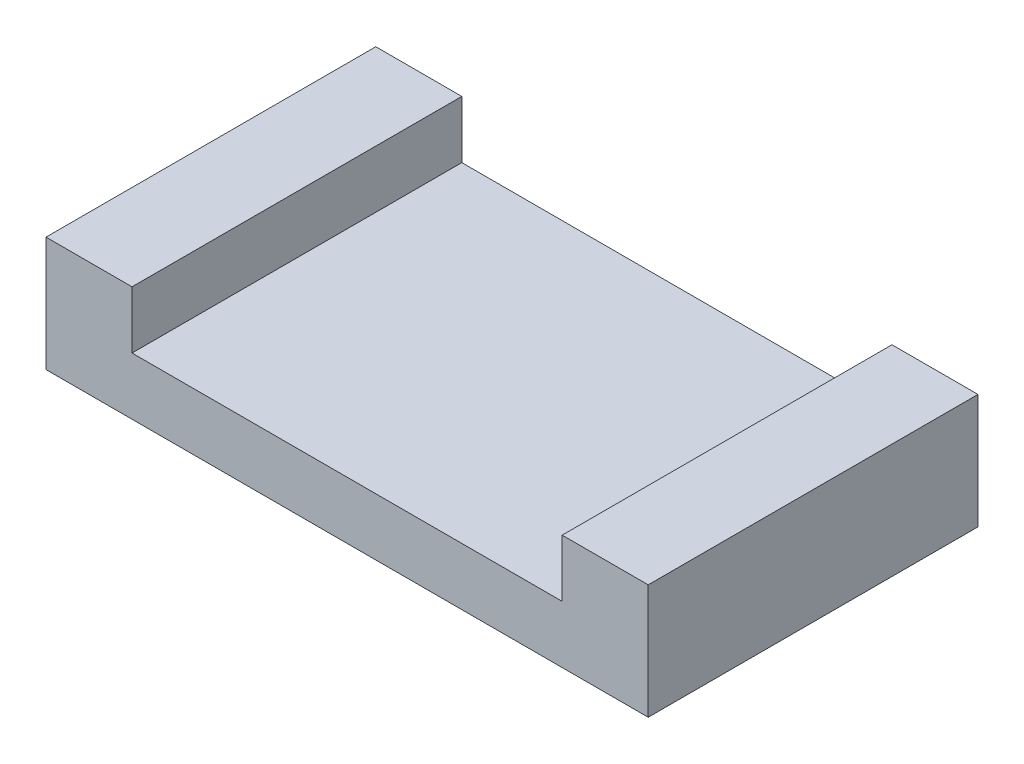
ISO-10303-21;
HEADER;
FILE_DESCRIPTION(('STEP AP214'),'2;1');
FILE_NAME('part.step','',(''),(''),'','','');
FILE_SCHEMA(('AUTOMOTIVE_DESIGN { 1 0 10303 214 1 1 1 1 }'));
ENDSEC;
DATA;
#1=APPLICATION_CONTEXT('core data for automotive mechanical design processes');
#2=APPLICATION_PROTOCOL_DEFINITION('international standard','automotive_design',2000,#1);
#3=PRODUCT_CONTEXT('',#1,'mechanical');
#4=PRODUCT('Part','Part','',(#3));
#5=PRODUCT_RELATED_PRODUCT_CATEGORY('part','',(#4));
#6=PRODUCT_DEFINITION_FORMATION('','',#4);
#7=PRODUCT_DEFINITION_CONTEXT('part definition',#1,'design');
#8=PRODUCT_DEFINITION('design','',#6,#7);
#9=PRODUCT_DEFINITION_SHAPE('','',#8);
#10=(LENGTH_UNIT() NAMED_UNIT(*) SI_UNIT(.MILLI.,.METRE.));
#11=(NAMED_UNIT(*) PLANE_ANGLE_UNIT() SI_UNIT($,.RADIAN.));
#12=(NAMED_UNIT(*) SI_UNIT($,.STERADIAN.) SOLID_ANGLE_UNIT());
#13=UNCERTAINTY_MEASURE_WITH_UNIT(LENGTH_MEASURE(1.E-05),#10,'distance_accuracy_value','');
#14=(GEOMETRIC_REPRESENTATION_CONTEXT(3) GLOBAL_UNCERTAINTY_ASSIGNED_CONTEXT((#13)) GLOBAL_UNIT_ASSIGNED_CONTEXT((#10,
#11,#12)) REPRESENTATION_CONTEXT('',''));
#15=CARTESIAN_POINT('',(0.,0.,0.));
#16=DIRECTION('',(0.,0.,1.));
#17=DIRECTION('',(1.,0.,0.));
#18=AXIS2_PLACEMENT_3D('',#15,#16,#17);
#19=CARTESIAN_POINT('',(0.,20.,0.));
#20=DIRECTION('',(0.,1.,0.));
#21=DIRECTION('',(0.,0.,1.));
#22=AXIS2_PLACEMENT_3D('',#19,#20,#21);
#23=PLANE('',#22);
#24=DIRECTION('',(1.,0.,0.));
#25=VECTOR('',#24,1.);
#26=CARTESIAN_POINT('',(105.,20.,57.5));
#27=LINE('',#26,#25);
#28=CARTESIAN_POINT('',(-75.,20.,57.5));
#29=VERTEX_POINT('',#28);
#30=CARTESIAN_POINT('',(75.,20.,57.5));
#31=VERTEX_POINT('',#30);
#32=EDGE_CURVE('E53',#29,#31,#27,.T.);
#33=ORIENTED_EDGE('',*,*,#32,.T.);
#34=DIRECTION('',(0.,0.,1.));
#35=VECTOR('',#34,1.);
#36=CARTESIAN_POINT('',(75.,20.,-57.5));
#37=LINE('',#36,#35);
#38=CARTESIAN_POINT('',(75.,20.,-57.5));
#39=VERTEX_POINT('',#38);
#40=EDGE_CURVE('E48',#39,#31,#37,.T.);
#41=ORIENTED_EDGE('',*,*,#40,.F.);
#42=DIRECTION('',(-1.,0.,0.));
#43=VECTOR('',#42,1.);
#44=CARTESIAN_POINT('',(105.,20.,-57.5));
#45=LINE('',#44,#43);
#46=CARTESIAN_POINT('',(-75.,20.,-57.5));
#47=VERTEX_POINT('',#46);
#48=EDGE_CURVE('E151',#39,#47,#45,.T.);
#49=ORIENTED_EDGE('',*,*,#48,.T.);
#50=DIRECTION('',(0.,0.,-1.));
#51=VECTOR('',#50,1.);
#52=CARTESIAN_POINT('',(-75.,20.,-57.5));
#53=LINE('',#52,#51);
#54=EDGE_CURVE('E130',#29,#47,#53,.T.);
#55=ORIENTED_EDGE('',*,*,#54,.F.);
#56=EDGE_LOOP('',(#33,#41,#49,#55));
#57=FACE_BOUND('',#56,.T.);
#58=ADVANCED_FACE('F33',(#57),#23,.T.);
#59=CARTESIAN_POINT('',(-105.,20.,57.5));
#60=DIRECTION('',(1.,0.,0.));
#61=DIRECTION('',(0.,0.,-1.));
#62=AXIS2_PLACEMENT_3D('',#59,#60,#61);
#63=PLANE('',#62);
#64=DIRECTION('',(0.,0.,1.));
#65=VECTOR('',#64,1.);
#66=CARTESIAN_POINT('',(-105.,0.,57.5));
#67=LINE('',#66,#65);
#68=CARTESIAN_POINT('',(-105.,0.,-57.5));
#69=VERTEX_POINT('',#68);
#70=CARTESIAN_POINT('',(-105.,0.,57.5));
#71=VERTEX_POINT('',#70);
#72=EDGE_CURVE('E149',#69,#71,#67,.T.);
#73=ORIENTED_EDGE('',*,*,#72,.T.);
#74=DIRECTION('',(0.,-1.,0.));
#75=VECTOR('',#74,1.);
#76=CARTESIAN_POINT('',(-105.,20.,57.5));
#77=LINE('',#76,#75);
#78=CARTESIAN_POINT('',(-105.,40.,57.5));
#79=VERTEX_POINT('',#78);
#80=EDGE_CURVE('E11',#79,#71,#77,.T.);
#81=ORIENTED_EDGE('',*,*,#80,.F.);
#82=DIRECTION('',(0.,0.,1.));
#83=VECTOR('',#82,1.);
#84=CARTESIAN_POINT('',(-105.,40.,-57.5));
#85=LINE('',#84,#83);
#86=CARTESIAN_POINT('',(-105.,40.,-57.5));
#87=VERTEX_POINT('',#86);
#88=EDGE_CURVE('E131',#87,#79,#85,.T.);
#89=ORIENTED_EDGE('',*,*,#88,.F.);
#90=DIRECTION('',(0.,-1.,0.));
#91=VECTOR('',#90,1.);
#92=CARTESIAN_POINT('',(-105.,20.,-57.5));
#93=LINE('',#92,#91);
#94=EDGE_CURVE('E106',#87,#69,#93,.T.);
#95=ORIENTED_EDGE('',*,*,#94,.T.);
#96=EDGE_LOOP('',(#73,#81,#89,#95));
#97=FACE_BOUND('',#96,.T.);
#98=ADVANCED_FACE('F35',(#97),#63,.F.);
#99=CARTESIAN_POINT('',(105.,20.,57.5));
#100=DIRECTION('',(0.,0.,-1.));
#101=DIRECTION('',(-1.,0.,0.));
#102=AXIS2_PLACEMENT_3D('',#99,#100,#101);
#103=PLANE('',#102);
#104=DIRECTION('',(1.,0.,0.));
#105=VECTOR('',#104,1.);
#106=CARTESIAN_POINT('',(105.,0.,57.5));
#107=LINE('',#106,#105);
#108=CARTESIAN_POINT('',(105.,0.,57.5));
#109=VERTEX_POINT('',#108);
#110=EDGE_CURVE('E156',#71,#109,#107,.T.);
#111=ORIENTED_EDGE('',*,*,#110,.T.);
#112=DIRECTION('',(0.,-1.,0.));
#113=VECTOR('',#112,1.);
#114=CARTESIAN_POINT('',(105.,20.,57.5));
#115=LINE('',#114,#113);
#116=CARTESIAN_POINT('',(105.,40.,57.5));
#117=VERTEX_POINT('',#116);
#118=EDGE_CURVE('E41',#117,#109,#115,.T.);
#119=ORIENTED_EDGE('',*,*,#118,.F.);
#120=DIRECTION('',(1.,0.,0.));
#121=VECTOR('',#120,1.);
#122=CARTESIAN_POINT('',(105.,40.,57.5));
#123=LINE('',#122,#121);
#124=CARTESIAN_POINT('',(75.,40.,57.5));
#125=VERTEX_POINT('',#124);
#126=EDGE_CURVE('E120',#125,#117,#123,.T.);
#127=ORIENTED_EDGE('',*,*,#126,.F.);
#128=DIRECTION('',(0.,-1.,0.));
#129=VECTOR('',#128,1.);
#130=CARTESIAN_POINT('',(75.,40.,57.5));
#131=LINE('',#130,#129);
#132=EDGE_CURVE('E125',#125,#31,#131,.T.);
#133=ORIENTED_EDGE('',*,*,#132,.T.);
#134=ORIENTED_EDGE('',*,*,#32,.F.);
#135=DIRECTION('',(0.,-1.,0.));
#136=VECTOR('',#135,1.);
#137=CARTESIAN_POINT('',(-75.,40.,57.5));
#138=LINE('',#137,#136);
#139=CARTESIAN_POINT('',(-75.,40.,57.5));
#140=VERTEX_POINT('',#139);
#141=EDGE_CURVE('E146',#140,#29,#138,.T.);
#142=ORIENTED_EDGE('',*,*,#141,.F.);
#143=DIRECTION('',(1.,0.,0.));
#144=VECTOR('',#143,1.);
#145=CARTESIAN_POINT('',(-105.,40.,57.5));
#146=LINE('',#145,#144);
#147=EDGE_CURVE('E134',#79,#140,#146,.T.);
#148=ORIENTED_EDGE('',*,*,#147,.F.);
#149=ORIENTED_EDGE('',*,*,#80,.T.);
#150=EDGE_LOOP('',(#111,#119,#127,#133,#134,#142,#148,#149));
#151=FACE_BOUND('',#150,.T.);
#152=ADVANCED_FACE('F176',(#151),#103,.F.);
#153=CARTESIAN_POINT('',(105.,20.,57.5));
#154=DIRECTION('',(-1.,0.,0.));
#155=DIRECTION('',(0.,0.,1.));
#156=AXIS2_PLACEMENT_3D('',#153,#154,#155);
#157=PLANE('',#156);
#158=DIRECTION('',(0.,0.,-1.));
#159=VECTOR('',#158,1.);
#160=CARTESIAN_POINT('',(105.,0.,57.5));
#161=LINE('',#160,#159);
#162=CARTESIAN_POINT('',(105.,0.,-57.5));
#163=VERTEX_POINT('',#162);
#164=EDGE_CURVE('E103',#109,#163,#161,.T.);
#165=ORIENTED_EDGE('',*,*,#164,.T.);
#166=DIRECTION('',(0.,-1.,0.));
#167=VECTOR('',#166,1.);
#168=CARTESIAN_POINT('',(105.,20.,-57.5));
#169=LINE('',#168,#167);
#170=CARTESIAN_POINT('',(105.,40.,-57.5));
#171=VERTEX_POINT('',#170);
#172=EDGE_CURVE('E96',#171,#163,#169,.T.);
#173=ORIENTED_EDGE('',*,*,#172,.F.);
#174=DIRECTION('',(0.,0.,-1.));
#175=VECTOR('',#174,1.);
#176=CARTESIAN_POINT('',(105.,40.,-57.5));
#177=LINE('',#176,#175);
#178=EDGE_CURVE('E101',#117,#171,#177,.T.);
#179=ORIENTED_EDGE('',*,*,#178,.F.);
#180=ORIENTED_EDGE('',*,*,#118,.T.);
#181=EDGE_LOOP('',(#165,#173,#179,#180));
#182=FACE_BOUND('',#181,.T.);
#183=ADVANCED_FACE('F98',(#182),#157,.F.);
#184=CARTESIAN_POINT('',(105.,20.,-57.5));
#185=DIRECTION('',(0.,0.,1.));
#186=DIRECTION('',(1.,0.,0.));
#187=AXIS2_PLACEMENT_3D('',#184,#185,#186);
#188=PLANE('',#187);
#189=DIRECTION('',(-1.,0.,0.));
#190=VECTOR('',#189,1.);
#191=CARTESIAN_POINT('',(105.,0.,-57.5));
#192=LINE('',#191,#190);
#193=EDGE_CURVE('E152',#163,#69,#192,.T.);
#194=ORIENTED_EDGE('',*,*,#193,.T.);
#195=ORIENTED_EDGE('',*,*,#94,.F.);
#196=DIRECTION('',(-1.,0.,0.));
#197=VECTOR('',#196,1.);
#198=CARTESIAN_POINT('',(-105.,40.,-57.5));
#199=LINE('',#198,#197);
#200=CARTESIAN_POINT('',(-75.,40.,-57.5));
#201=VERTEX_POINT('',#200);
#202=EDGE_CURVE('E138',#201,#87,#199,.T.);
#203=ORIENTED_EDGE('',*,*,#202,.F.);
#204=DIRECTION('',(0.,-1.,0.));
#205=VECTOR('',#204,1.);
#206=CARTESIAN_POINT('',(-75.,40.,-57.5));
#207=LINE('',#206,#205);
#208=EDGE_CURVE('E141',#201,#47,#207,.T.);
#209=ORIENTED_EDGE('',*,*,#208,.T.);
#210=ORIENTED_EDGE('',*,*,#48,.F.);
#211=DIRECTION('',(0.,-1.,0.));
#212=VECTOR('',#211,1.);
#213=CARTESIAN_POINT('',(75.,40.,-57.5));
#214=LINE('',#213,#212);
#215=CARTESIAN_POINT('',(75.,40.,-57.5));
#216=VERTEX_POINT('',#215);
#217=EDGE_CURVE('E112',#216,#39,#214,.T.);
#218=ORIENTED_EDGE('',*,*,#217,.F.);
#219=DIRECTION('',(-1.,0.,0.));
#220=VECTOR('',#219,1.);
#221=CARTESIAN_POINT('',(105.,40.,-57.5));
#222=LINE('',#221,#220);
#223=EDGE_CURVE('E109',#171,#216,#222,.T.);
#224=ORIENTED_EDGE('',*,*,#223,.F.);
#225=ORIENTED_EDGE('',*,*,#172,.T.);
#226=EDGE_LOOP('',(#194,#195,#203,#209,#210,#218,#224,#225));
#227=FACE_BOUND('',#226,.T.);
#228=ADVANCED_FACE('F110',(#227),#188,.F.);
#229=CARTESIAN_POINT('',(0.,0.,0.));
#230=DIRECTION('',(0.,1.,0.));
#231=DIRECTION('',(0.,0.,1.));
#232=AXIS2_PLACEMENT_3D('',#229,#230,#231);
#233=PLANE('',#232);
#234=ORIENTED_EDGE('',*,*,#72,.F.);
#235=ORIENTED_EDGE('',*,*,#193,.F.);
#236=ORIENTED_EDGE('',*,*,#164,.F.);
#237=ORIENTED_EDGE('',*,*,#110,.F.);
#238=EDGE_LOOP('',(#234,#235,#236,#237));
#239=FACE_BOUND('',#238,.T.);
#240=ADVANCED_FACE('F164',(#239),#233,.F.);
#241=CARTESIAN_POINT('',(-75.,40.,-57.5));
#242=DIRECTION('',(-1.,0.,0.));
#243=DIRECTION('',(0.,0.,1.));
#244=AXIS2_PLACEMENT_3D('',#241,#242,#243);
#245=PLANE('',#244);
#246=ORIENTED_EDGE('',*,*,#54,.T.);
#247=ORIENTED_EDGE('',*,*,#208,.F.);
#248=DIRECTION('',(0.,0.,-1.));
#249=VECTOR('',#248,1.);
#250=CARTESIAN_POINT('',(-75.,40.,-57.5));
#251=LINE('',#250,#249);
#252=EDGE_CURVE('E136',#140,#201,#251,.T.);
#253=ORIENTED_EDGE('',*,*,#252,.F.);
#254=ORIENTED_EDGE('',*,*,#141,.T.);
#255=EDGE_LOOP('',(#246,#247,#253,#254));
#256=FACE_BOUND('',#255,.T.);
#257=ADVANCED_FACE('F175',(#256),#245,.F.);
#258=CARTESIAN_POINT('',(0.,40.,0.));
#259=DIRECTION('',(0.,1.,0.));
#260=DIRECTION('',(0.,0.,1.));
#261=AXIS2_PLACEMENT_3D('',#258,#259,#260);
#262=PLANE('',#261);
#263=ORIENTED_EDGE('',*,*,#88,.T.);
#264=ORIENTED_EDGE('',*,*,#147,.T.);
#265=ORIENTED_EDGE('',*,*,#252,.T.);
#266=ORIENTED_EDGE('',*,*,#202,.T.);
#267=EDGE_LOOP('',(#263,#264,#265,#266));
#268=FACE_BOUND('',#267,.T.);
#269=ADVANCED_FACE('F170',(#268),#262,.T.);
#270=CARTESIAN_POINT('',(75.,40.,-57.5));
#271=DIRECTION('',(1.,0.,0.));
#272=DIRECTION('',(0.,0.,-1.));
#273=AXIS2_PLACEMENT_3D('',#270,#271,#272);
#274=PLANE('',#273);
#275=ORIENTED_EDGE('',*,*,#40,.T.);
#276=ORIENTED_EDGE('',*,*,#132,.F.);
#277=DIRECTION('',(0.,0.,1.));
#278=VECTOR('',#277,1.);
#279=CARTESIAN_POINT('',(75.,40.,-57.5));
#280=LINE('',#279,#278);
#281=EDGE_CURVE('E115',#216,#125,#280,.T.);
#282=ORIENTED_EDGE('',*,*,#281,.F.);
#283=ORIENTED_EDGE('',*,*,#217,.T.);
#284=EDGE_LOOP('',(#275,#276,#282,#283));
#285=FACE_BOUND('',#284,.T.);
#286=ADVANCED_FACE('F179',(#285),#274,.F.);
#287=CARTESIAN_POINT('',(0.,40.,0.));
#288=DIRECTION('',(0.,-1.,0.));
#289=DIRECTION('',(0.,0.,-1.));
#290=AXIS2_PLACEMENT_3D('',#287,#288,#289);
#291=PLANE('',#290);
#292=ORIENTED_EDGE('',*,*,#178,.T.);
#293=ORIENTED_EDGE('',*,*,#223,.T.);
#294=ORIENTED_EDGE('',*,*,#281,.T.);
#295=ORIENTED_EDGE('',*,*,#126,.T.);
#296=EDGE_LOOP('',(#292,#293,#294,#295));
#297=FACE_BOUND('',#296,.T.);
#298=ADVANCED_FACE('F118',(#297),#291,.F.);
#299=CLOSED_SHELL('',(#58,#98,#152,#183,#228,#240,#257,#269,#286,#298));
#300=MANIFOLD_SOLID_BREP('B2',#299);
#301=ADVANCED_BREP_SHAPE_REPRESENTATION('',(#18,#300),#14);
#302=SHAPE_DEFINITION_REPRESENTATION(#9,#301);
ENDSEC;
END-ISO-10303-21;
